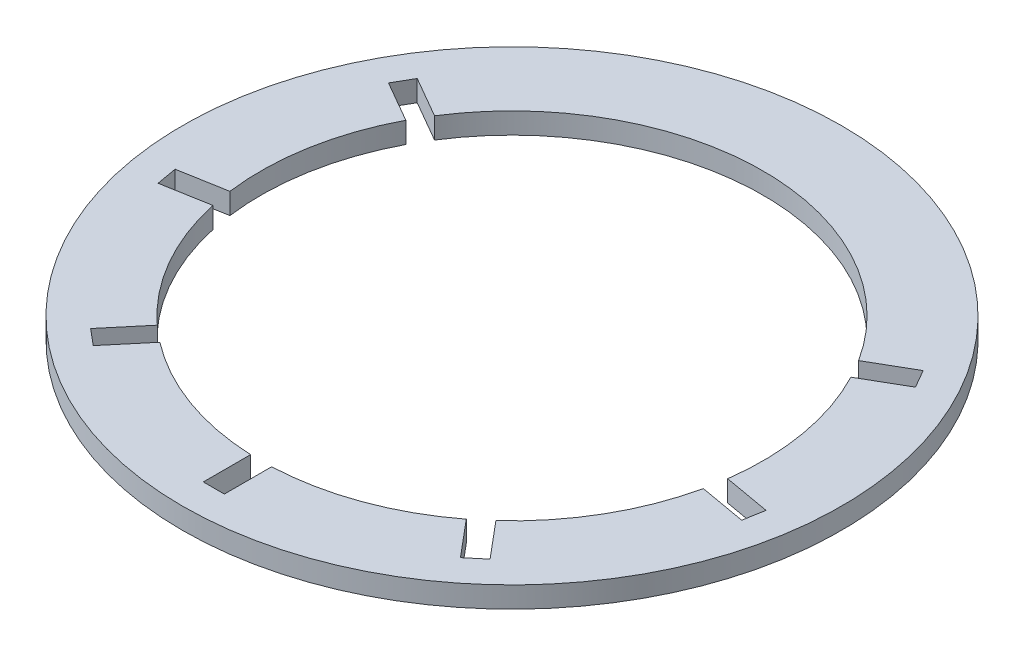
ISO-10303-21;
HEADER;
FILE_DESCRIPTION(('STEP AP214'),'2;1');
FILE_NAME('part.step','',(''),(''),'','','');
FILE_SCHEMA(('AUTOMOTIVE_DESIGN { 1 0 10303 214 1 1 1 1 }'));
ENDSEC;
DATA;
#1=APPLICATION_CONTEXT('core data for automotive mechanical design processes');
#2=APPLICATION_PROTOCOL_DEFINITION('international standard','automotive_design',2000,#1);
#3=PRODUCT_CONTEXT('',#1,'mechanical');
#4=PRODUCT('Part','Part','',(#3));
#5=PRODUCT_RELATED_PRODUCT_CATEGORY('part','',(#4));
#6=PRODUCT_DEFINITION_FORMATION('','',#4);
#7=PRODUCT_DEFINITION_CONTEXT('part definition',#1,'design');
#8=PRODUCT_DEFINITION('design','',#6,#7);
#9=PRODUCT_DEFINITION_SHAPE('','',#8);
#10=(LENGTH_UNIT() NAMED_UNIT(*) SI_UNIT(.MILLI.,.METRE.));
#11=(NAMED_UNIT(*) PLANE_ANGLE_UNIT() SI_UNIT($,.RADIAN.));
#12=(NAMED_UNIT(*) SI_UNIT($,.STERADIAN.) SOLID_ANGLE_UNIT());
#13=UNCERTAINTY_MEASURE_WITH_UNIT(LENGTH_MEASURE(1.E-05),#10,'distance_accuracy_value','');
#14=(GEOMETRIC_REPRESENTATION_CONTEXT(3) GLOBAL_UNCERTAINTY_ASSIGNED_CONTEXT((#13)) GLOBAL_UNIT_ASSIGNED_CONTEXT((#10,
#11,#12)) REPRESENTATION_CONTEXT('',''));
#15=CARTESIAN_POINT('',(0.,0.,0.));
#16=DIRECTION('',(0.,0.,1.));
#17=DIRECTION('',(1.,0.,0.));
#18=AXIS2_PLACEMENT_3D('',#15,#16,#17);
#19=CARTESIAN_POINT('',(0.,6.7,0.));
#20=DIRECTION('',(0.,1.,0.));
#21=DIRECTION('',(0.,0.,1.));
#22=AXIS2_PLACEMENT_3D('',#19,#20,#21);
#23=PLANE('',#22);
#24=CARTESIAN_POINT('',(0.,6.7,0.));
#25=DIRECTION('',(0.,1.,0.));
#26=DIRECTION('',(0.,0.,1.));
#27=AXIS2_PLACEMENT_3D('',#24,#25,#26);
#28=CIRCLE('',#27,105.);
#29=CARTESIAN_POINT('',(0.,6.7,105.));
#30=VERTEX_POINT('',#29);
#31=EDGE_CURVE('E383',#30,#30,#28,.T.);
#32=ORIENTED_EDGE('',*,*,#31,.T.);
#33=EDGE_LOOP('',(#32));
#34=FACE_BOUND('',#33,.T.);
#35=CARTESIAN_POINT('',(0.,6.7,0.));
#36=DIRECTION('',(0.,1.,0.));
#37=DIRECTION('',(0.,0.,1.));
#38=AXIS2_PLACEMENT_3D('',#35,#36,#37);
#39=CIRCLE('',#38,80.);
#40=CARTESIAN_POINT('',(-48.8116545838983,6.7,63.3831395308106));
#41=VERTEX_POINT('',#40);
#42=CARTESIAN_POINT('',(-3.35000000000002,6.7,79.9298285998413));
#43=VERTEX_POINT('',#42);
#44=EDGE_CURVE('E430',#41,#43,#39,.T.);
#45=ORIENTED_EDGE('',*,*,#44,.F.);
#46=DIRECTION('',(-0.642787609686541,0.,0.766044443118977));
#47=VECTOR('',#46,1.);
#48=CARTESIAN_POINT('',(-45.642821842042,6.7,59.6066717263732));
#49=LINE('',#48,#47);
#50=CARTESIAN_POINT('',(-58.4985740357728,6.7,74.9275605887527));
#51=VERTEX_POINT('',#50);
#52=EDGE_CURVE('E265',#41,#51,#49,.T.);
#53=ORIENTED_EDGE('',*,*,#52,.T.);
#54=DIRECTION('',(-0.766044443118977,0.,-0.642787609686541));
#55=VECTOR('',#54,1.);
#56=CARTESIAN_POINT('',(-58.4985740357728,6.7,74.9275605887527));
#57=LINE('',#56,#55);
#58=CARTESIAN_POINT('',(-63.63107180467,6.7,70.6208836038529));
#59=VERTEX_POINT('',#58);
#60=EDGE_CURVE('E268',#51,#59,#57,.T.);
#61=ORIENTED_EDGE('',*,*,#60,.T.);
#62=DIRECTION('',(-0.642787609686541,0.,0.766044443118977));
#63=VECTOR('',#62,1.);
#64=CARTESIAN_POINT('',(-50.7753196109391,6.7,55.2999947414733));
#65=LINE('',#64,#63);
#66=CARTESIAN_POINT('',(-53.9441523527954,6.7,59.0764625459107));
#67=VERTEX_POINT('',#66);
#68=EDGE_CURVE('E272',#67,#59,#65,.T.);
#69=ORIENTED_EDGE('',*,*,#68,.F.);
#70=CARTESIAN_POINT('',(-78.1337935068764,6.7,17.1787750501831));
#71=VERTEX_POINT('',#70);
#72=EDGE_CURVE('E427',#71,#67,#39,.T.);
#73=ORIENTED_EDGE('',*,*,#72,.F.);
#74=DIRECTION('',(-0.984807753012209,0.,0.173648177666926));
#75=VECTOR('',#74,1.);
#76=CARTESIAN_POINT('',(-73.2788600807314,6.7,16.3227192976104));
#77=LINE('',#76,#75);
#78=CARTESIAN_POINT('',(-92.9750151409756,6.7,19.7956828509489));
#79=VERTEX_POINT('',#78);
#80=EDGE_CURVE('E285',#71,#79,#77,.T.);
#81=ORIENTED_EDGE('',*,*,#80,.T.);
#82=DIRECTION('',(-0.173648177666929,0.,-0.984807753012208));
#83=VECTOR('',#82,1.);
#84=CARTESIAN_POINT('',(-92.9750151409756,6.7,19.7956828509489));
#85=LINE('',#84,#83);
#86=CARTESIAN_POINT('',(-94.138457931344,6.7,13.1974709057671));
#87=VERTEX_POINT('',#86);
#88=EDGE_CURVE('E288',#79,#87,#85,.T.);
#89=ORIENTED_EDGE('',*,*,#88,.T.);
#90=DIRECTION('',(-0.984807753012209,0.,0.173648177666927));
#91=VECTOR('',#90,1.);
#92=CARTESIAN_POINT('',(-74.4423028710998,6.7,9.72450735242858));
#93=LINE('',#92,#91);
#94=CARTESIAN_POINT('',(-79.2972362972449,6.7,10.5805631050013));
#95=VERTEX_POINT('',#94);
#96=EDGE_CURVE('E264',#95,#87,#93,.T.);
#97=ORIENTED_EDGE('',*,*,#96,.F.);
#98=CARTESIAN_POINT('',(-70.8962620875983,6.7,-37.0637291972431));
#99=VERTEX_POINT('',#98);
#100=EDGE_CURVE('E246',#99,#95,#39,.T.);
#101=ORIENTED_EDGE('',*,*,#100,.F.);
#102=DIRECTION('',(-0.866025403784436,0.,-0.500000000000004));
#103=VECTOR('',#102,1.);
#104=CARTESIAN_POINT('',(-66.6269052838327,6.7,-34.5988148973224));
#105=LINE('',#104,#103);
#106=CARTESIAN_POINT('',(-83.9474133595214,6.7,-44.5988148973225));
#107=VERTEX_POINT('',#106);
#108=EDGE_CURVE('E225',#99,#107,#105,.T.);
#109=ORIENTED_EDGE('',*,*,#108,.T.);
#110=DIRECTION('',(0.500000000000004,0.,-0.866025403784436));
#111=VECTOR('',#110,1.);
#112=CARTESIAN_POINT('',(-83.9474133595214,6.7,-44.5988148973225));
#113=LINE('',#112,#111);
#114=CARTESIAN_POINT('',(-80.5974133595214,6.7,-50.4011851026783));
#115=VERTEX_POINT('',#114);
#116=EDGE_CURVE('E235',#107,#115,#113,.T.);
#117=ORIENTED_EDGE('',*,*,#116,.T.);
#118=DIRECTION('',(-0.866025403784436,0.,-0.500000000000005));
#119=VECTOR('',#118,1.);
#120=CARTESIAN_POINT('',(-63.2769052838327,6.7,-40.4011851026782));
#121=LINE('',#120,#119);
#122=CARTESIAN_POINT('',(-67.5462620875983,6.7,-42.8660994025988));
#123=VERTEX_POINT('',#122);
#124=EDGE_CURVE('E240',#123,#115,#121,.T.);
#125=ORIENTED_EDGE('',*,*,#124,.F.);
#126=CARTESIAN_POINT('',(67.5462620875983,6.7,-42.8660994025988));
#127=VERTEX_POINT('',#126);
#128=EDGE_CURVE('E374',#127,#123,#39,.T.);
#129=ORIENTED_EDGE('',*,*,#128,.F.);
#130=DIRECTION('',(0.866025403784437,0.,-0.500000000000003));
#131=VECTOR('',#130,1.);
#132=CARTESIAN_POINT('',(63.2769052838327,6.7,-40.4011851026781));
#133=LINE('',#132,#131);
#134=CARTESIAN_POINT('',(80.5974133595215,6.7,-50.4011851026782));
#135=VERTEX_POINT('',#134);
#136=EDGE_CURVE('E358',#127,#135,#133,.T.);
#137=ORIENTED_EDGE('',*,*,#136,.T.);
#138=DIRECTION('',(0.500000000000004,0.,0.866025403784436));
#139=VECTOR('',#138,1.);
#140=CARTESIAN_POINT('',(80.5974133595215,6.7,-50.4011851026782));
#141=LINE('',#140,#139);
#142=CARTESIAN_POINT('',(83.9474133595215,6.7,-44.5988148973225));
#143=VERTEX_POINT('',#142);
#144=EDGE_CURVE('E364',#135,#143,#141,.T.);
#145=ORIENTED_EDGE('',*,*,#144,.T.);
#146=DIRECTION('',(0.866025403784436,0.,-0.500000000000004));
#147=VECTOR('',#146,1.);
#148=CARTESIAN_POINT('',(66.6269052838327,6.7,-34.5988148973224));
#149=LINE('',#148,#147);
#150=CARTESIAN_POINT('',(70.8962620875983,6.7,-37.0637291972431));
#151=VERTEX_POINT('',#150);
#152=EDGE_CURVE('E313',#151,#143,#149,.T.);
#153=ORIENTED_EDGE('',*,*,#152,.F.);
#154=CARTESIAN_POINT('',(79.2972362972448,6.7,10.5805631050014));
#155=VERTEX_POINT('',#154);
#156=EDGE_CURVE('E378',#155,#151,#39,.T.);
#157=ORIENTED_EDGE('',*,*,#156,.F.);
#158=DIRECTION('',(0.984807753012208,0.,0.173648177666927));
#159=VECTOR('',#158,1.);
#160=CARTESIAN_POINT('',(74.4423028710998,6.7,9.72450735242866));
#161=LINE('',#160,#159);
#162=CARTESIAN_POINT('',(94.138457931344,6.7,13.1974709057672));
#163=VERTEX_POINT('',#162);
#164=EDGE_CURVE('E305',#155,#163,#161,.T.);
#165=ORIENTED_EDGE('',*,*,#164,.T.);
#166=DIRECTION('',(-0.173648177666925,0.,0.984807753012209));
#167=VECTOR('',#166,1.);
#168=CARTESIAN_POINT('',(94.138457931344,6.7,13.1974709057672));
#169=LINE('',#168,#167);
#170=CARTESIAN_POINT('',(92.9750151409756,6.7,19.795682850949));
#171=VERTEX_POINT('',#170);
#172=EDGE_CURVE('E308',#163,#171,#169,.T.);
#173=ORIENTED_EDGE('',*,*,#172,.T.);
#174=DIRECTION('',(0.984807753012209,0.,0.173648177666928));
#175=VECTOR('',#174,1.);
#176=CARTESIAN_POINT('',(73.2788600807314,6.7,16.3227192976105));
#177=LINE('',#176,#175);
#178=CARTESIAN_POINT('',(78.1337935068764,6.7,17.1787750501832));
#179=VERTEX_POINT('',#178);
#180=EDGE_CURVE('E311',#179,#171,#177,.T.);
#181=ORIENTED_EDGE('',*,*,#180,.F.);
#182=CARTESIAN_POINT('',(53.9441523527954,6.7,59.0764625459108));
#183=VERTEX_POINT('',#182);
#184=EDGE_CURVE('E436',#183,#179,#39,.T.);
#185=ORIENTED_EDGE('',*,*,#184,.F.);
#186=DIRECTION('',(0.642787609686541,0.,0.766044443118977));
#187=VECTOR('',#186,1.);
#188=CARTESIAN_POINT('',(50.7753196109391,6.7,55.2999947414734));
#189=LINE('',#188,#187);
#190=CARTESIAN_POINT('',(63.6310718046699,6.7,70.6208836038529));
#191=VERTEX_POINT('',#190);
#192=EDGE_CURVE('E325',#183,#191,#189,.T.);
#193=ORIENTED_EDGE('',*,*,#192,.T.);
#194=DIRECTION('',(-0.766044443118976,0.,0.642787609686542));
#195=VECTOR('',#194,1.);
#196=CARTESIAN_POINT('',(63.6310718046699,6.7,70.6208836038529));
#197=LINE('',#196,#195);
#198=CARTESIAN_POINT('',(58.4985740357727,6.7,74.9275605887527));
#199=VERTEX_POINT('',#198);
#200=EDGE_CURVE('E328',#191,#199,#197,.T.);
#201=ORIENTED_EDGE('',*,*,#200,.T.);
#202=DIRECTION('',(0.64278760968654,0.,0.766044443118977));
#203=VECTOR('',#202,1.);
#204=CARTESIAN_POINT('',(45.6428218420419,6.7,59.6066717263732));
#205=LINE('',#204,#203);
#206=CARTESIAN_POINT('',(48.8116545838982,6.7,63.3831395308106));
#207=VERTEX_POINT('',#206);
#208=EDGE_CURVE('E304',#207,#199,#205,.T.);
#209=ORIENTED_EDGE('',*,*,#208,.F.);
#210=CARTESIAN_POINT('',(3.34999999999999,6.7,79.9298285998413));
#211=VERTEX_POINT('',#210);
#212=EDGE_CURVE('E432',#211,#207,#39,.T.);
#213=ORIENTED_EDGE('',*,*,#212,.F.);
#214=DIRECTION('',(0.,0.,1.));
#215=VECTOR('',#214,1.);
#216=CARTESIAN_POINT('',(3.34999999999999,6.7,75.));
#217=LINE('',#216,#215);
#218=CARTESIAN_POINT('',(3.34999999999998,6.7,95.));
#219=VERTEX_POINT('',#218);
#220=EDGE_CURVE('E341',#211,#219,#217,.T.);
#221=ORIENTED_EDGE('',*,*,#220,.T.);
#222=DIRECTION('',(-1.,0.,0.));
#223=VECTOR('',#222,1.);
#224=CARTESIAN_POINT('',(3.34999999999998,6.7,95.));
#225=LINE('',#224,#223);
#226=CARTESIAN_POINT('',(-3.35000000000003,6.7,95.));
#227=VERTEX_POINT('',#226);
#228=EDGE_CURVE('E344',#219,#227,#225,.T.);
#229=ORIENTED_EDGE('',*,*,#228,.T.);
#230=DIRECTION('',(0.,0.,1.));
#231=VECTOR('',#230,1.);
#232=CARTESIAN_POINT('',(-3.35000000000002,6.7,75.));
#233=LINE('',#232,#231);
#234=EDGE_CURVE('E324',#43,#227,#233,.T.);
#235=ORIENTED_EDGE('',*,*,#234,.F.);
#236=EDGE_LOOP('',(#45,#53,#61,#69,#73,#81,#89,#97,#101,#109,#117,#125,#129,#137,#145,#153,#157,
#165,#173,#181,#185,#193,#201,#209,#213,#221,#229,#235));
#237=FACE_BOUND('',#236,.T.);
#238=ADVANCED_FACE('F35',(#34,#237),#23,.T.);
#239=CARTESIAN_POINT('',(0.,0.,0.));
#240=DIRECTION('',(0.,1.,0.));
#241=DIRECTION('',(0.,0.,1.));
#242=AXIS2_PLACEMENT_3D('',#239,#240,#241);
#243=PLANE('',#242);
#244=CARTESIAN_POINT('',(0.,0.,0.));
#245=DIRECTION('',(0.,1.,0.));
#246=DIRECTION('',(0.,0.,1.));
#247=AXIS2_PLACEMENT_3D('',#244,#245,#246);
#248=CIRCLE('',#247,105.);
#249=CARTESIAN_POINT('',(0.,0.,105.));
#250=VERTEX_POINT('',#249);
#251=EDGE_CURVE('E377',#250,#250,#248,.T.);
#252=ORIENTED_EDGE('',*,*,#251,.F.);
#253=EDGE_LOOP('',(#252));
#254=FACE_BOUND('',#253,.T.);
#255=DIRECTION('',(-0.642787609686541,0.,0.766044443118977));
#256=VECTOR('',#255,1.);
#257=CARTESIAN_POINT('',(-45.642821842042,0.,59.6066717263732));
#258=LINE('',#257,#256);
#259=CARTESIAN_POINT('',(-48.8116545838983,0.,63.3831395308106));
#260=VERTEX_POINT('',#259);
#261=CARTESIAN_POINT('',(-58.4985740357728,0.,74.9275605887527));
#262=VERTEX_POINT('',#261);
#263=EDGE_CURVE('E261',#260,#262,#258,.T.);
#264=ORIENTED_EDGE('',*,*,#263,.F.);
#265=CARTESIAN_POINT('',(0.,0.,0.));
#266=DIRECTION('',(0.,1.,0.));
#267=DIRECTION('',(0.,0.,1.));
#268=AXIS2_PLACEMENT_3D('',#265,#266,#267);
#269=CIRCLE('',#268,80.);
#270=CARTESIAN_POINT('',(-3.35000000000002,0.,79.9298285998413));
#271=VERTEX_POINT('',#270);
#272=EDGE_CURVE('E470',#260,#271,#269,.T.);
#273=ORIENTED_EDGE('',*,*,#272,.T.);
#274=DIRECTION('',(0.,0.,1.));
#275=VECTOR('',#274,1.);
#276=CARTESIAN_POINT('',(-3.35000000000002,0.,75.));
#277=LINE('',#276,#275);
#278=CARTESIAN_POINT('',(-3.35000000000003,0.,95.));
#279=VERTEX_POINT('',#278);
#280=EDGE_CURVE('E345',#271,#279,#277,.T.);
#281=ORIENTED_EDGE('',*,*,#280,.T.);
#282=DIRECTION('',(-1.,0.,0.));
#283=VECTOR('',#282,1.);
#284=CARTESIAN_POINT('',(3.34999999999998,0.,95.));
#285=LINE('',#284,#283);
#286=CARTESIAN_POINT('',(3.34999999999998,0.,95.));
#287=VERTEX_POINT('',#286);
#288=EDGE_CURVE('E350',#287,#279,#285,.T.);
#289=ORIENTED_EDGE('',*,*,#288,.F.);
#290=DIRECTION('',(0.,0.,1.));
#291=VECTOR('',#290,1.);
#292=CARTESIAN_POINT('',(3.34999999999999,0.,75.));
#293=LINE('',#292,#291);
#294=CARTESIAN_POINT('',(3.34999999999999,0.,79.9298285998413));
#295=VERTEX_POINT('',#294);
#296=EDGE_CURVE('E339',#295,#287,#293,.T.);
#297=ORIENTED_EDGE('',*,*,#296,.F.);
#298=CARTESIAN_POINT('',(48.8116545838982,0.,63.3831395308106));
#299=VERTEX_POINT('',#298);
#300=EDGE_CURVE('E466',#295,#299,#269,.T.);
#301=ORIENTED_EDGE('',*,*,#300,.T.);
#302=DIRECTION('',(0.64278760968654,0.,0.766044443118977));
#303=VECTOR('',#302,1.);
#304=CARTESIAN_POINT('',(45.6428218420419,0.,59.6066717263732));
#305=LINE('',#304,#303);
#306=CARTESIAN_POINT('',(58.4985740357727,0.,74.9275605887527));
#307=VERTEX_POINT('',#306);
#308=EDGE_CURVE('E58',#299,#307,#305,.T.);
#309=ORIENTED_EDGE('',*,*,#308,.T.);
#310=DIRECTION('',(-0.766044443118976,0.,0.642787609686542));
#311=VECTOR('',#310,1.);
#312=CARTESIAN_POINT('',(63.6310718046699,0.,70.6208836038529));
#313=LINE('',#312,#311);
#314=CARTESIAN_POINT('',(63.6310718046699,0.,70.6208836038529));
#315=VERTEX_POINT('',#314);
#316=EDGE_CURVE('E333',#315,#307,#313,.T.);
#317=ORIENTED_EDGE('',*,*,#316,.F.);
#318=DIRECTION('',(0.642787609686541,0.,0.766044443118977));
#319=VECTOR('',#318,1.);
#320=CARTESIAN_POINT('',(50.7753196109391,0.,55.2999947414734));
#321=LINE('',#320,#319);
#322=CARTESIAN_POINT('',(53.9441523527954,0.,59.0764625459108));
#323=VERTEX_POINT('',#322);
#324=EDGE_CURVE('E321',#323,#315,#321,.T.);
#325=ORIENTED_EDGE('',*,*,#324,.F.);
#326=CARTESIAN_POINT('',(78.1337935068764,0.,17.1787750501832));
#327=VERTEX_POINT('',#326);
#328=EDGE_CURVE('E464',#323,#327,#269,.T.);
#329=ORIENTED_EDGE('',*,*,#328,.T.);
#330=DIRECTION('',(0.984807753012209,0.,0.173648177666928));
#331=VECTOR('',#330,1.);
#332=CARTESIAN_POINT('',(73.2788600807314,0.,16.3227192976105));
#333=LINE('',#332,#331);
#334=CARTESIAN_POINT('',(92.9750151409756,0.,19.795682850949));
#335=VERTEX_POINT('',#334);
#336=EDGE_CURVE('E50',#327,#335,#333,.T.);
#337=ORIENTED_EDGE('',*,*,#336,.T.);
#338=DIRECTION('',(-0.173648177666925,0.,0.984807753012209));
#339=VECTOR('',#338,1.);
#340=CARTESIAN_POINT('',(94.138457931344,0.,13.1974709057672));
#341=LINE('',#340,#339);
#342=CARTESIAN_POINT('',(94.138457931344,0.,13.1974709057672));
#343=VERTEX_POINT('',#342);
#344=EDGE_CURVE('E315',#343,#335,#341,.T.);
#345=ORIENTED_EDGE('',*,*,#344,.F.);
#346=DIRECTION('',(0.984807753012208,0.,0.173648177666927));
#347=VECTOR('',#346,1.);
#348=CARTESIAN_POINT('',(74.4423028710998,0.,9.72450735242866));
#349=LINE('',#348,#347);
#350=CARTESIAN_POINT('',(79.2972362972448,0.,10.5805631050014));
#351=VERTEX_POINT('',#350);
#352=EDGE_CURVE('E301',#351,#343,#349,.T.);
#353=ORIENTED_EDGE('',*,*,#352,.F.);
#354=CARTESIAN_POINT('',(70.8962620875983,0.,-37.0637291972431));
#355=VERTEX_POINT('',#354);
#356=EDGE_CURVE('E371',#351,#355,#269,.T.);
#357=ORIENTED_EDGE('',*,*,#356,.T.);
#358=DIRECTION('',(0.866025403784436,0.,-0.500000000000004));
#359=VECTOR('',#358,1.);
#360=CARTESIAN_POINT('',(66.6269052838327,0.,-34.5988148973224));
#361=LINE('',#360,#359);
#362=CARTESIAN_POINT('',(83.9474133595215,0.,-44.5988148973225));
#363=VERTEX_POINT('',#362);
#364=EDGE_CURVE('E354',#355,#363,#361,.T.);
#365=ORIENTED_EDGE('',*,*,#364,.T.);
#366=DIRECTION('',(0.500000000000004,0.,0.866025403784436));
#367=VECTOR('',#366,1.);
#368=CARTESIAN_POINT('',(80.5974133595215,0.,-50.4011851026782));
#369=LINE('',#368,#367);
#370=CARTESIAN_POINT('',(80.5974133595215,0.,-50.4011851026782));
#371=VERTEX_POINT('',#370);
#372=EDGE_CURVE('E357',#371,#363,#369,.T.);
#373=ORIENTED_EDGE('',*,*,#372,.F.);
#374=DIRECTION('',(0.866025403784437,0.,-0.500000000000003));
#375=VECTOR('',#374,1.);
#376=CARTESIAN_POINT('',(63.2769052838327,0.,-40.4011851026781));
#377=LINE('',#376,#375);
#378=CARTESIAN_POINT('',(67.5462620875983,0.,-42.8660994025988));
#379=VERTEX_POINT('',#378);
#380=EDGE_CURVE('E360',#379,#371,#377,.T.);
#381=ORIENTED_EDGE('',*,*,#380,.F.);
#382=CARTESIAN_POINT('',(-67.5462620875983,0.,-42.8660994025988));
#383=VERTEX_POINT('',#382);
#384=EDGE_CURVE('E379',#379,#383,#269,.T.);
#385=ORIENTED_EDGE('',*,*,#384,.T.);
#386=DIRECTION('',(-0.866025403784436,0.,-0.500000000000005));
#387=VECTOR('',#386,1.);
#388=CARTESIAN_POINT('',(-63.2769052838327,0.,-40.4011851026782));
#389=LINE('',#388,#387);
#390=CARTESIAN_POINT('',(-80.5974133595214,0.,-50.4011851026783));
#391=VERTEX_POINT('',#390);
#392=EDGE_CURVE('E247',#383,#391,#389,.T.);
#393=ORIENTED_EDGE('',*,*,#392,.T.);
#394=DIRECTION('',(0.500000000000004,0.,-0.866025403784436));
#395=VECTOR('',#394,1.);
#396=CARTESIAN_POINT('',(-83.9474133595214,0.,-44.5988148973225));
#397=LINE('',#396,#395);
#398=CARTESIAN_POINT('',(-83.9474133595214,0.,-44.5988148973225));
#399=VERTEX_POINT('',#398);
#400=EDGE_CURVE('E250',#399,#391,#397,.T.);
#401=ORIENTED_EDGE('',*,*,#400,.F.);
#402=DIRECTION('',(-0.866025403784436,0.,-0.500000000000004));
#403=VECTOR('',#402,1.);
#404=CARTESIAN_POINT('',(-66.6269052838327,0.,-34.5988148973224));
#405=LINE('',#404,#403);
#406=CARTESIAN_POINT('',(-70.8962620875983,0.,-37.0637291972431));
#407=VERTEX_POINT('',#406);
#408=EDGE_CURVE('E228',#407,#399,#405,.T.);
#409=ORIENTED_EDGE('',*,*,#408,.F.);
#410=CARTESIAN_POINT('',(-79.2972362972449,0.,10.5805631050013));
#411=VERTEX_POINT('',#410);
#412=EDGE_CURVE('E382',#407,#411,#269,.T.);
#413=ORIENTED_EDGE('',*,*,#412,.T.);
#414=DIRECTION('',(-0.984807753012209,0.,0.173648177666927));
#415=VECTOR('',#414,1.);
#416=CARTESIAN_POINT('',(-74.4423028710998,0.,9.72450735242858));
#417=LINE('',#416,#415);
#418=CARTESIAN_POINT('',(-94.138457931344,0.,13.1974709057671));
#419=VERTEX_POINT('',#418);
#420=EDGE_CURVE('E289',#411,#419,#417,.T.);
#421=ORIENTED_EDGE('',*,*,#420,.T.);
#422=DIRECTION('',(-0.173648177666929,0.,-0.984807753012208));
#423=VECTOR('',#422,1.);
#424=CARTESIAN_POINT('',(-92.9750151409756,0.,19.7956828509489));
#425=LINE('',#424,#423);
#426=CARTESIAN_POINT('',(-92.9750151409756,0.,19.7956828509489));
#427=VERTEX_POINT('',#426);
#428=EDGE_CURVE('E294',#427,#419,#425,.T.);
#429=ORIENTED_EDGE('',*,*,#428,.F.);
#430=DIRECTION('',(-0.984807753012209,0.,0.173648177666926));
#431=VECTOR('',#430,1.);
#432=CARTESIAN_POINT('',(-73.2788600807314,0.,16.3227192976104));
#433=LINE('',#432,#431);
#434=CARTESIAN_POINT('',(-78.1337935068764,0.,17.1787750501831));
#435=VERTEX_POINT('',#434);
#436=EDGE_CURVE('E283',#435,#427,#433,.T.);
#437=ORIENTED_EDGE('',*,*,#436,.F.);
#438=CARTESIAN_POINT('',(-53.9441523527954,0.,59.0764625459107));
#439=VERTEX_POINT('',#438);
#440=EDGE_CURVE('E474',#435,#439,#269,.T.);
#441=ORIENTED_EDGE('',*,*,#440,.T.);
#442=DIRECTION('',(-0.642787609686541,0.,0.766044443118977));
#443=VECTOR('',#442,1.);
#444=CARTESIAN_POINT('',(-50.7753196109391,0.,55.2999947414733));
#445=LINE('',#444,#443);
#446=CARTESIAN_POINT('',(-63.63107180467,0.,70.6208836038529));
#447=VERTEX_POINT('',#446);
#448=EDGE_CURVE('E269',#439,#447,#445,.T.);
#449=ORIENTED_EDGE('',*,*,#448,.T.);
#450=DIRECTION('',(-0.766044443118977,0.,-0.642787609686541));
#451=VECTOR('',#450,1.);
#452=CARTESIAN_POINT('',(-58.4985740357728,0.,74.9275605887527));
#453=LINE('',#452,#451);
#454=EDGE_CURVE('E276',#262,#447,#453,.T.);
#455=ORIENTED_EDGE('',*,*,#454,.F.);
#456=EDGE_LOOP('',(#264,#273,#281,#289,#297,#301,#309,#317,#325,#329,#337,#345,#353,#357,#365,
#373,#381,#385,#393,#401,#409,#413,#421,#429,#437,#441,#449,#455));
#457=FACE_BOUND('',#456,.T.);
#458=ADVANCED_FACE('F460',(#254,#457),#243,.F.);
#459=CARTESIAN_POINT('',(0.,6.7,0.));
#460=DIRECTION('',(0.,-1.,0.));
#461=DIRECTION('',(0.,0.,-1.));
#462=AXIS2_PLACEMENT_3D('',#459,#460,#461);
#463=CYLINDRICAL_SURFACE('',#462,80.);
#464=ORIENTED_EDGE('',*,*,#272,.F.);
#465=DIRECTION('',(0.,-1.,0.));
#466=VECTOR('',#465,1.);
#467=CARTESIAN_POINT('',(-48.8116545838983,6.7,63.3831395308106));
#468=LINE('',#467,#466);
#469=EDGE_CURVE('E11',#260,#41,#468,.F.);
#470=ORIENTED_EDGE('',*,*,#469,.T.);
#471=ORIENTED_EDGE('',*,*,#44,.T.);
#472=DIRECTION('',(0.,-1.,0.));
#473=VECTOR('',#472,1.);
#474=CARTESIAN_POINT('',(-3.35000000000002,6.7,79.9298285998413));
#475=LINE('',#474,#473);
#476=EDGE_CURVE('E404',#271,#43,#475,.F.);
#477=ORIENTED_EDGE('',*,*,#476,.F.);
#478=EDGE_LOOP('',(#464,#470,#471,#477));
#479=FACE_BOUND('',#478,.T.);
#480=ADVANCED_FACE('F509',(#479),#463,.F.);
#481=DIRECTION('',(0.,-1.,0.));
#482=VECTOR('',#481,1.);
#483=CARTESIAN_POINT('',(-53.9441523527954,6.7,59.0764625459107));
#484=LINE('',#483,#482);
#485=EDGE_CURVE('E43',#439,#67,#484,.F.);
#486=ORIENTED_EDGE('',*,*,#485,.F.);
#487=ORIENTED_EDGE('',*,*,#440,.F.);
#488=DIRECTION('',(0.,-1.,0.));
#489=VECTOR('',#488,1.);
#490=CARTESIAN_POINT('',(-78.1337935068764,6.7,17.1787750501831));
#491=LINE('',#490,#489);
#492=EDGE_CURVE('E415',#435,#71,#491,.F.);
#493=ORIENTED_EDGE('',*,*,#492,.T.);
#494=ORIENTED_EDGE('',*,*,#72,.T.);
#495=EDGE_LOOP('',(#486,#487,#493,#494));
#496=FACE_BOUND('',#495,.T.);
#497=ADVANCED_FACE('F429',(#496),#463,.F.);
#498=DIRECTION('',(0.,-1.,0.));
#499=VECTOR('',#498,1.);
#500=CARTESIAN_POINT('',(-79.2972362972449,6.7,10.5805631050013));
#501=LINE('',#500,#499);
#502=EDGE_CURVE('E413',#411,#95,#501,.F.);
#503=ORIENTED_EDGE('',*,*,#502,.F.);
#504=ORIENTED_EDGE('',*,*,#412,.F.);
#505=DIRECTION('',(0.,-1.,0.));
#506=VECTOR('',#505,1.);
#507=CARTESIAN_POINT('',(-70.8962620875983,6.7,-37.0637291972431));
#508=LINE('',#507,#506);
#509=EDGE_CURVE('E411',#407,#99,#508,.F.);
#510=ORIENTED_EDGE('',*,*,#509,.T.);
#511=ORIENTED_EDGE('',*,*,#100,.T.);
#512=EDGE_LOOP('',(#503,#504,#510,#511));
#513=FACE_BOUND('',#512,.T.);
#514=ADVANCED_FACE('F482',(#513),#463,.F.);
#515=ORIENTED_EDGE('',*,*,#300,.F.);
#516=DIRECTION('',(0.,-1.,0.));
#517=VECTOR('',#516,1.);
#518=CARTESIAN_POINT('',(3.34999999999999,6.7,79.9298285998413));
#519=LINE('',#518,#517);
#520=EDGE_CURVE('E406',#295,#211,#519,.F.);
#521=ORIENTED_EDGE('',*,*,#520,.T.);
#522=ORIENTED_EDGE('',*,*,#212,.T.);
#523=DIRECTION('',(0.,-1.,0.));
#524=VECTOR('',#523,1.);
#525=CARTESIAN_POINT('',(48.8116545838983,6.7,63.3831395308106));
#526=LINE('',#525,#524);
#527=EDGE_CURVE('E399',#299,#207,#526,.F.);
#528=ORIENTED_EDGE('',*,*,#527,.F.);
#529=EDGE_LOOP('',(#515,#521,#522,#528));
#530=FACE_BOUND('',#529,.T.);
#531=ADVANCED_FACE('F566',(#530),#463,.F.);
#532=ORIENTED_EDGE('',*,*,#328,.F.);
#533=DIRECTION('',(0.,-1.,0.));
#534=VECTOR('',#533,1.);
#535=CARTESIAN_POINT('',(53.9441523527954,6.7,59.0764625459108));
#536=LINE('',#535,#534);
#537=EDGE_CURVE('E401',#323,#183,#536,.F.);
#538=ORIENTED_EDGE('',*,*,#537,.T.);
#539=ORIENTED_EDGE('',*,*,#184,.T.);
#540=DIRECTION('',(0.,-1.,0.));
#541=VECTOR('',#540,1.);
#542=CARTESIAN_POINT('',(78.1337935068764,6.7,17.1787750501832));
#543=LINE('',#542,#541);
#544=EDGE_CURVE('E394',#327,#179,#543,.F.);
#545=ORIENTED_EDGE('',*,*,#544,.F.);
#546=EDGE_LOOP('',(#532,#538,#539,#545));
#547=FACE_BOUND('',#546,.T.);
#548=ADVANCED_FACE('F564',(#547),#463,.F.);
#549=ORIENTED_EDGE('',*,*,#356,.F.);
#550=DIRECTION('',(0.,-1.,0.));
#551=VECTOR('',#550,1.);
#552=CARTESIAN_POINT('',(79.2972362972448,6.7,10.5805631050014));
#553=LINE('',#552,#551);
#554=EDGE_CURVE('E396',#351,#155,#553,.F.);
#555=ORIENTED_EDGE('',*,*,#554,.T.);
#556=ORIENTED_EDGE('',*,*,#156,.T.);
#557=DIRECTION('',(0.,-1.,0.));
#558=VECTOR('',#557,1.);
#559=CARTESIAN_POINT('',(70.8962620875983,6.7,-37.0637291972431));
#560=LINE('',#559,#558);
#561=EDGE_CURVE('E386',#355,#151,#560,.F.);
#562=ORIENTED_EDGE('',*,*,#561,.F.);
#563=EDGE_LOOP('',(#549,#555,#556,#562));
#564=FACE_BOUND('',#563,.T.);
#565=ADVANCED_FACE('F446',(#564),#463,.F.);
#566=DIRECTION('',(0.,-1.,0.));
#567=VECTOR('',#566,1.);
#568=CARTESIAN_POINT('',(-67.5462620875983,6.7,-42.8660994025988));
#569=LINE('',#568,#567);
#570=EDGE_CURVE('E409',#383,#123,#569,.F.);
#571=ORIENTED_EDGE('',*,*,#570,.F.);
#572=ORIENTED_EDGE('',*,*,#384,.F.);
#573=DIRECTION('',(0.,-1.,0.));
#574=VECTOR('',#573,1.);
#575=CARTESIAN_POINT('',(67.5462620875983,6.7,-42.8660994025988));
#576=LINE('',#575,#574);
#577=EDGE_CURVE('E391',#379,#127,#576,.F.);
#578=ORIENTED_EDGE('',*,*,#577,.T.);
#579=ORIENTED_EDGE('',*,*,#128,.T.);
#580=EDGE_LOOP('',(#571,#572,#578,#579));
#581=FACE_BOUND('',#580,.T.);
#582=ADVANCED_FACE('F512',(#581),#463,.F.);
#583=CARTESIAN_POINT('',(0.,6.7,0.));
#584=DIRECTION('',(0.,-1.,0.));
#585=DIRECTION('',(0.,0.,-1.));
#586=AXIS2_PLACEMENT_3D('',#583,#584,#585);
#587=CYLINDRICAL_SURFACE('',#586,105.);
#588=ORIENTED_EDGE('',*,*,#31,.F.);
#589=EDGE_LOOP('',(#588));
#590=FACE_BOUND('',#589,.T.);
#591=ORIENTED_EDGE('',*,*,#251,.T.);
#592=EDGE_LOOP('',(#591));
#593=FACE_BOUND('',#592,.T.);
#594=ADVANCED_FACE('F37',(#590,#593),#587,.T.);
#595=CARTESIAN_POINT('',(63.2769052838327,0.,-40.4011851026781));
#596=DIRECTION('',(0.500000000000003,0.,0.866025403784437));
#597=DIRECTION('',(0.866025403784437,0.,-0.500000000000003));
#598=AXIS2_PLACEMENT_3D('',#595,#596,#597);
#599=PLANE('',#598);
#600=ORIENTED_EDGE('',*,*,#380,.T.);
#601=DIRECTION('',(0.,1.,0.));
#602=VECTOR('',#601,1.);
#603=CARTESIAN_POINT('',(80.5974133595215,0.,-50.4011851026782));
#604=LINE('',#603,#602);
#605=EDGE_CURVE('E369',#371,#135,#604,.T.);
#606=ORIENTED_EDGE('',*,*,#605,.T.);
#607=ORIENTED_EDGE('',*,*,#136,.F.);
#608=ORIENTED_EDGE('',*,*,#577,.F.);
#609=EDGE_LOOP('',(#600,#606,#607,#608));
#610=FACE_BOUND('',#609,.T.);
#611=ADVANCED_FACE('F521',(#610),#599,.T.);
#612=CARTESIAN_POINT('',(80.5974133595215,0.,-50.4011851026782));
#613=DIRECTION('',(-0.866025403784436,0.,0.500000000000004));
#614=DIRECTION('',(0.500000000000004,0.,0.866025403784436));
#615=AXIS2_PLACEMENT_3D('',#612,#613,#614);
#616=PLANE('',#615);
#617=ORIENTED_EDGE('',*,*,#144,.F.);
#618=ORIENTED_EDGE('',*,*,#605,.F.);
#619=ORIENTED_EDGE('',*,*,#372,.T.);
#620=DIRECTION('',(0.,1.,0.));
#621=VECTOR('',#620,1.);
#622=CARTESIAN_POINT('',(83.9474133595215,0.,-44.5988148973225));
#623=LINE('',#622,#621);
#624=EDGE_CURVE('E362',#363,#143,#623,.T.);
#625=ORIENTED_EDGE('',*,*,#624,.T.);
#626=EDGE_LOOP('',(#617,#618,#619,#625));
#627=FACE_BOUND('',#626,.T.);
#628=ADVANCED_FACE('F456',(#627),#616,.T.);
#629=CARTESIAN_POINT('',(66.6269052838327,0.,-34.5988148973224));
#630=DIRECTION('',(0.500000000000004,0.,0.866025403784436));
#631=DIRECTION('',(0.866025403784436,0.,-0.500000000000004));
#632=AXIS2_PLACEMENT_3D('',#629,#630,#631);
#633=PLANE('',#632);
#634=ORIENTED_EDGE('',*,*,#561,.T.);
#635=ORIENTED_EDGE('',*,*,#152,.T.);
#636=ORIENTED_EDGE('',*,*,#624,.F.);
#637=ORIENTED_EDGE('',*,*,#364,.F.);
#638=EDGE_LOOP('',(#634,#635,#636,#637));
#639=FACE_BOUND('',#638,.T.);
#640=ADVANCED_FACE('F450',(#639),#633,.F.);
#641=CARTESIAN_POINT('',(74.4423028710998,0.,9.72450735242866));
#642=DIRECTION('',(-0.173648177666927,0.,0.984807753012209));
#643=DIRECTION('',(0.984807753012209,0.,0.173648177666927));
#644=AXIS2_PLACEMENT_3D('',#641,#642,#643);
#645=PLANE('',#644);
#646=ORIENTED_EDGE('',*,*,#352,.T.);
#647=DIRECTION('',(0.,1.,0.));
#648=VECTOR('',#647,1.);
#649=CARTESIAN_POINT('',(94.138457931344,0.,13.1974709057672));
#650=LINE('',#649,#648);
#651=EDGE_CURVE('E302',#343,#163,#650,.T.);
#652=ORIENTED_EDGE('',*,*,#651,.T.);
#653=ORIENTED_EDGE('',*,*,#164,.F.);
#654=ORIENTED_EDGE('',*,*,#554,.F.);
#655=EDGE_LOOP('',(#646,#652,#653,#654));
#656=FACE_BOUND('',#655,.T.);
#657=ADVANCED_FACE('F518',(#656),#645,.T.);
#658=CARTESIAN_POINT('',(94.138457931344,0.,13.1974709057672));
#659=DIRECTION('',(-0.984807753012209,0.,-0.173648177666925));
#660=DIRECTION('',(-0.173648177666925,0.,0.984807753012209));
#661=AXIS2_PLACEMENT_3D('',#658,#659,#660);
#662=PLANE('',#661);
#663=ORIENTED_EDGE('',*,*,#172,.F.);
#664=ORIENTED_EDGE('',*,*,#651,.F.);
#665=ORIENTED_EDGE('',*,*,#344,.T.);
#666=DIRECTION('',(0.,1.,0.));
#667=VECTOR('',#666,1.);
#668=CARTESIAN_POINT('',(92.9750151409756,0.,19.795682850949));
#669=LINE('',#668,#667);
#670=EDGE_CURVE('E298',#335,#171,#669,.T.);
#671=ORIENTED_EDGE('',*,*,#670,.T.);
#672=EDGE_LOOP('',(#663,#664,#665,#671));
#673=FACE_BOUND('',#672,.T.);
#674=ADVANCED_FACE('F551',(#673),#662,.T.);
#675=CARTESIAN_POINT('',(73.2788600807314,0.,16.3227192976105));
#676=DIRECTION('',(-0.173648177666928,0.,0.984807753012208));
#677=DIRECTION('',(0.984807753012209,0.,0.173648177666928));
#678=AXIS2_PLACEMENT_3D('',#675,#676,#677);
#679=PLANE('',#678);
#680=ORIENTED_EDGE('',*,*,#544,.T.);
#681=ORIENTED_EDGE('',*,*,#180,.T.);
#682=ORIENTED_EDGE('',*,*,#670,.F.);
#683=ORIENTED_EDGE('',*,*,#336,.F.);
#684=EDGE_LOOP('',(#680,#681,#682,#683));
#685=FACE_BOUND('',#684,.T.);
#686=ADVANCED_FACE('F542',(#685),#679,.F.);
#687=CARTESIAN_POINT('',(50.7753196109391,0.,55.2999947414734));
#688=DIRECTION('',(-0.766044443118977,0.,0.642787609686541));
#689=DIRECTION('',(0.642787609686541,0.,0.766044443118977));
#690=AXIS2_PLACEMENT_3D('',#687,#688,#689);
#691=PLANE('',#690);
#692=ORIENTED_EDGE('',*,*,#324,.T.);
#693=DIRECTION('',(0.,1.,0.));
#694=VECTOR('',#693,1.);
#695=CARTESIAN_POINT('',(63.6310718046699,0.,70.6208836038529));
#696=LINE('',#695,#694);
#697=EDGE_CURVE('E322',#315,#191,#696,.T.);
#698=ORIENTED_EDGE('',*,*,#697,.T.);
#699=ORIENTED_EDGE('',*,*,#192,.F.);
#700=ORIENTED_EDGE('',*,*,#537,.F.);
#701=EDGE_LOOP('',(#692,#698,#699,#700));
#702=FACE_BOUND('',#701,.T.);
#703=ADVANCED_FACE('F538',(#702),#691,.T.);
#704=CARTESIAN_POINT('',(63.6310718046699,0.,70.6208836038529));
#705=DIRECTION('',(-0.642787609686542,0.,-0.766044443118976));
#706=DIRECTION('',(-0.766044443118976,0.,0.642787609686542));
#707=AXIS2_PLACEMENT_3D('',#704,#705,#706);
#708=PLANE('',#707);
#709=ORIENTED_EDGE('',*,*,#200,.F.);
#710=ORIENTED_EDGE('',*,*,#697,.F.);
#711=ORIENTED_EDGE('',*,*,#316,.T.);
#712=DIRECTION('',(0.,1.,0.));
#713=VECTOR('',#712,1.);
#714=CARTESIAN_POINT('',(58.4985740357727,0.,74.9275605887527));
#715=LINE('',#714,#713);
#716=EDGE_CURVE('E318',#307,#199,#715,.T.);
#717=ORIENTED_EDGE('',*,*,#716,.T.);
#718=EDGE_LOOP('',(#709,#710,#711,#717));
#719=FACE_BOUND('',#718,.T.);
#720=ADVANCED_FACE('F541',(#719),#708,.T.);
#721=CARTESIAN_POINT('',(45.6428218420419,0.,59.6066717263732));
#722=DIRECTION('',(-0.766044443118977,0.,0.64278760968654));
#723=DIRECTION('',(0.64278760968654,0.,0.766044443118977));
#724=AXIS2_PLACEMENT_3D('',#721,#722,#723);
#725=PLANE('',#724);
#726=ORIENTED_EDGE('',*,*,#527,.T.);
#727=ORIENTED_EDGE('',*,*,#208,.T.);
#728=ORIENTED_EDGE('',*,*,#716,.F.);
#729=ORIENTED_EDGE('',*,*,#308,.F.);
#730=EDGE_LOOP('',(#726,#727,#728,#729));
#731=FACE_BOUND('',#730,.T.);
#732=ADVANCED_FACE('F529',(#731),#725,.F.);
#733=CARTESIAN_POINT('',(3.34999999999999,0.,75.));
#734=DIRECTION('',(-1.,0.,0.));
#735=DIRECTION('',(0.,0.,1.));
#736=AXIS2_PLACEMENT_3D('',#733,#734,#735);
#737=PLANE('',#736);
#738=ORIENTED_EDGE('',*,*,#296,.T.);
#739=DIRECTION('',(0.,1.,0.));
#740=VECTOR('',#739,1.);
#741=CARTESIAN_POINT('',(3.34999999999998,0.,95.));
#742=LINE('',#741,#740);
#743=EDGE_CURVE('E274',#287,#219,#742,.T.);
#744=ORIENTED_EDGE('',*,*,#743,.T.);
#745=ORIENTED_EDGE('',*,*,#220,.F.);
#746=ORIENTED_EDGE('',*,*,#520,.F.);
#747=EDGE_LOOP('',(#738,#744,#745,#746));
#748=FACE_BOUND('',#747,.T.);
#749=ADVANCED_FACE('F525',(#748),#737,.T.);
#750=CARTESIAN_POINT('',(3.34999999999998,0.,95.));
#751=DIRECTION('',(0.,0.,-1.));
#752=DIRECTION('',(-1.,0.,0.));
#753=AXIS2_PLACEMENT_3D('',#750,#751,#752);
#754=PLANE('',#753);
#755=ORIENTED_EDGE('',*,*,#228,.F.);
#756=ORIENTED_EDGE('',*,*,#743,.F.);
#757=ORIENTED_EDGE('',*,*,#288,.T.);
#758=DIRECTION('',(0.,1.,0.));
#759=VECTOR('',#758,1.);
#760=CARTESIAN_POINT('',(-3.35000000000003,0.,95.));
#761=LINE('',#760,#759);
#762=EDGE_CURVE('E336',#279,#227,#761,.T.);
#763=ORIENTED_EDGE('',*,*,#762,.T.);
#764=EDGE_LOOP('',(#755,#756,#757,#763));
#765=FACE_BOUND('',#764,.T.);
#766=ADVANCED_FACE('F528',(#765),#754,.T.);
#767=CARTESIAN_POINT('',(-3.35000000000002,0.,75.));
#768=DIRECTION('',(-1.,0.,0.));
#769=DIRECTION('',(0.,0.,1.));
#770=AXIS2_PLACEMENT_3D('',#767,#768,#769);
#771=PLANE('',#770);
#772=ORIENTED_EDGE('',*,*,#476,.T.);
#773=ORIENTED_EDGE('',*,*,#234,.T.);
#774=ORIENTED_EDGE('',*,*,#762,.F.);
#775=ORIENTED_EDGE('',*,*,#280,.F.);
#776=EDGE_LOOP('',(#772,#773,#774,#775));
#777=FACE_BOUND('',#776,.T.);
#778=ADVANCED_FACE('F533',(#777),#771,.F.);
#779=CARTESIAN_POINT('',(-66.6269052838327,0.,-34.5988148973224));
#780=DIRECTION('',(0.500000000000004,0.,-0.866025403784436));
#781=DIRECTION('',(-0.866025403784436,0.,-0.500000000000004));
#782=AXIS2_PLACEMENT_3D('',#779,#780,#781);
#783=PLANE('',#782);
#784=ORIENTED_EDGE('',*,*,#408,.T.);
#785=DIRECTION('',(0.,1.,0.));
#786=VECTOR('',#785,1.);
#787=CARTESIAN_POINT('',(-83.9474133595214,0.,-44.5988148973225));
#788=LINE('',#787,#786);
#789=EDGE_CURVE('E221',#399,#107,#788,.T.);
#790=ORIENTED_EDGE('',*,*,#789,.T.);
#791=ORIENTED_EDGE('',*,*,#108,.F.);
#792=ORIENTED_EDGE('',*,*,#509,.F.);
#793=EDGE_LOOP('',(#784,#790,#791,#792));
#794=FACE_BOUND('',#793,.T.);
#795=ADVANCED_FACE('F223',(#794),#783,.T.);
#796=CARTESIAN_POINT('',(-83.9474133595214,0.,-44.5988148973225));
#797=DIRECTION('',(0.866025403784437,0.,0.500000000000004));
#798=DIRECTION('',(0.500000000000004,0.,-0.866025403784437));
#799=AXIS2_PLACEMENT_3D('',#796,#797,#798);
#800=PLANE('',#799);
#801=ORIENTED_EDGE('',*,*,#116,.F.);
#802=ORIENTED_EDGE('',*,*,#789,.F.);
#803=ORIENTED_EDGE('',*,*,#400,.T.);
#804=DIRECTION('',(0.,1.,0.));
#805=VECTOR('',#804,1.);
#806=CARTESIAN_POINT('',(-80.5974133595214,0.,-50.4011851026783));
#807=LINE('',#806,#805);
#808=EDGE_CURVE('E231',#391,#115,#807,.T.);
#809=ORIENTED_EDGE('',*,*,#808,.T.);
#810=EDGE_LOOP('',(#801,#802,#803,#809));
#811=FACE_BOUND('',#810,.T.);
#812=ADVANCED_FACE('F236',(#811),#800,.T.);
#813=CARTESIAN_POINT('',(-63.2769052838327,0.,-40.4011851026782));
#814=DIRECTION('',(0.500000000000005,0.,-0.866025403784436));
#815=DIRECTION('',(-0.866025403784436,0.,-0.500000000000005));
#816=AXIS2_PLACEMENT_3D('',#813,#814,#815);
#817=PLANE('',#816);
#818=ORIENTED_EDGE('',*,*,#570,.T.);
#819=ORIENTED_EDGE('',*,*,#124,.T.);
#820=ORIENTED_EDGE('',*,*,#808,.F.);
#821=ORIENTED_EDGE('',*,*,#392,.F.);
#822=EDGE_LOOP('',(#818,#819,#820,#821));
#823=FACE_BOUND('',#822,.T.);
#824=ADVANCED_FACE('F493',(#823),#817,.F.);
#825=CARTESIAN_POINT('',(-73.2788600807314,0.,16.3227192976104));
#826=DIRECTION('',(-0.173648177666926,0.,-0.984807753012209));
#827=DIRECTION('',(-0.984807753012209,0.,0.173648177666926));
#828=AXIS2_PLACEMENT_3D('',#825,#826,#827);
#829=PLANE('',#828);
#830=ORIENTED_EDGE('',*,*,#436,.T.);
#831=DIRECTION('',(0.,1.,0.));
#832=VECTOR('',#831,1.);
#833=CARTESIAN_POINT('',(-92.9750151409756,0.,19.7956828509489));
#834=LINE('',#833,#832);
#835=EDGE_CURVE('E255',#427,#79,#834,.T.);
#836=ORIENTED_EDGE('',*,*,#835,.T.);
#837=ORIENTED_EDGE('',*,*,#80,.F.);
#838=ORIENTED_EDGE('',*,*,#492,.F.);
#839=EDGE_LOOP('',(#830,#836,#837,#838));
#840=FACE_BOUND('',#839,.T.);
#841=ADVANCED_FACE('F491',(#840),#829,.T.);
#842=CARTESIAN_POINT('',(-92.9750151409756,0.,19.7956828509489));
#843=DIRECTION('',(0.984807753012208,0.,-0.173648177666929));
#844=DIRECTION('',(-0.173648177666929,0.,-0.984807753012208));
#845=AXIS2_PLACEMENT_3D('',#842,#843,#844);
#846=PLANE('',#845);
#847=ORIENTED_EDGE('',*,*,#88,.F.);
#848=ORIENTED_EDGE('',*,*,#835,.F.);
#849=ORIENTED_EDGE('',*,*,#428,.T.);
#850=DIRECTION('',(0.,1.,0.));
#851=VECTOR('',#850,1.);
#852=CARTESIAN_POINT('',(-94.138457931344,0.,13.1974709057671));
#853=LINE('',#852,#851);
#854=EDGE_CURVE('E280',#419,#87,#853,.T.);
#855=ORIENTED_EDGE('',*,*,#854,.T.);
#856=EDGE_LOOP('',(#847,#848,#849,#855));
#857=FACE_BOUND('',#856,.T.);
#858=ADVANCED_FACE('F489',(#857),#846,.T.);
#859=CARTESIAN_POINT('',(-74.4423028710998,0.,9.72450735242858));
#860=DIRECTION('',(-0.173648177666927,0.,-0.984807753012209));
#861=DIRECTION('',(-0.984807753012209,0.,0.173648177666927));
#862=AXIS2_PLACEMENT_3D('',#859,#860,#861);
#863=PLANE('',#862);
#864=ORIENTED_EDGE('',*,*,#502,.T.);
#865=ORIENTED_EDGE('',*,*,#96,.T.);
#866=ORIENTED_EDGE('',*,*,#854,.F.);
#867=ORIENTED_EDGE('',*,*,#420,.F.);
#868=EDGE_LOOP('',(#864,#865,#866,#867));
#869=FACE_BOUND('',#868,.T.);
#870=ADVANCED_FACE('F484',(#869),#863,.F.);
#871=CARTESIAN_POINT('',(-45.642821842042,0.,59.6066717263732));
#872=DIRECTION('',(-0.766044443118977,0.,-0.642787609686541));
#873=DIRECTION('',(-0.642787609686541,0.,0.766044443118977));
#874=AXIS2_PLACEMENT_3D('',#871,#872,#873);
#875=PLANE('',#874);
#876=ORIENTED_EDGE('',*,*,#263,.T.);
#877=DIRECTION('',(0.,1.,0.));
#878=VECTOR('',#877,1.);
#879=CARTESIAN_POINT('',(-58.4985740357728,0.,74.9275605887527));
#880=LINE('',#879,#878);
#881=EDGE_CURVE('E262',#262,#51,#880,.T.);
#882=ORIENTED_EDGE('',*,*,#881,.T.);
#883=ORIENTED_EDGE('',*,*,#52,.F.);
#884=ORIENTED_EDGE('',*,*,#469,.F.);
#885=EDGE_LOOP('',(#876,#882,#883,#884));
#886=FACE_BOUND('',#885,.T.);
#887=ADVANCED_FACE('F580',(#886),#875,.T.);
#888=CARTESIAN_POINT('',(-58.4985740357728,0.,74.9275605887527));
#889=DIRECTION('',(0.642787609686541,0.,-0.766044443118977));
#890=DIRECTION('',(-0.766044443118977,0.,-0.642787609686541));
#891=AXIS2_PLACEMENT_3D('',#888,#889,#890);
#892=PLANE('',#891);
#893=ORIENTED_EDGE('',*,*,#60,.F.);
#894=ORIENTED_EDGE('',*,*,#881,.F.);
#895=ORIENTED_EDGE('',*,*,#454,.T.);
#896=DIRECTION('',(0.,1.,0.));
#897=VECTOR('',#896,1.);
#898=CARTESIAN_POINT('',(-63.63107180467,0.,70.6208836038529));
#899=LINE('',#898,#897);
#900=EDGE_CURVE('E258',#447,#59,#899,.T.);
#901=ORIENTED_EDGE('',*,*,#900,.T.);
#902=EDGE_LOOP('',(#893,#894,#895,#901));
#903=FACE_BOUND('',#902,.T.);
#904=ADVANCED_FACE('F734',(#903),#892,.T.);
#905=CARTESIAN_POINT('',(-50.7753196109391,0.,55.2999947414733));
#906=DIRECTION('',(-0.766044443118977,0.,-0.642787609686541));
#907=DIRECTION('',(-0.642787609686541,0.,0.766044443118977));
#908=AXIS2_PLACEMENT_3D('',#905,#906,#907);
#909=PLANE('',#908);
#910=ORIENTED_EDGE('',*,*,#485,.T.);
#911=ORIENTED_EDGE('',*,*,#68,.T.);
#912=ORIENTED_EDGE('',*,*,#900,.F.);
#913=ORIENTED_EDGE('',*,*,#448,.F.);
#914=EDGE_LOOP('',(#910,#911,#912,#913));
#915=FACE_BOUND('',#914,.T.);
#916=ADVANCED_FACE('F420',(#915),#909,.F.);
#917=CLOSED_SHELL('',(#238,#458,#480,#497,#514,#531,#548,#565,#582,#594,#611,#628,#640,#657,
#674,#686,#703,#720,#732,#749,#766,#778,#795,#812,#824,#841,#858,#870,#887,#904,#916));
#918=MANIFOLD_SOLID_BREP('B2',#917);
#919=ADVANCED_BREP_SHAPE_REPRESENTATION('',(#18,#918),#14);
#920=SHAPE_DEFINITION_REPRESENTATION(#9,#919);
ENDSEC;
END-ISO-10303-21;
